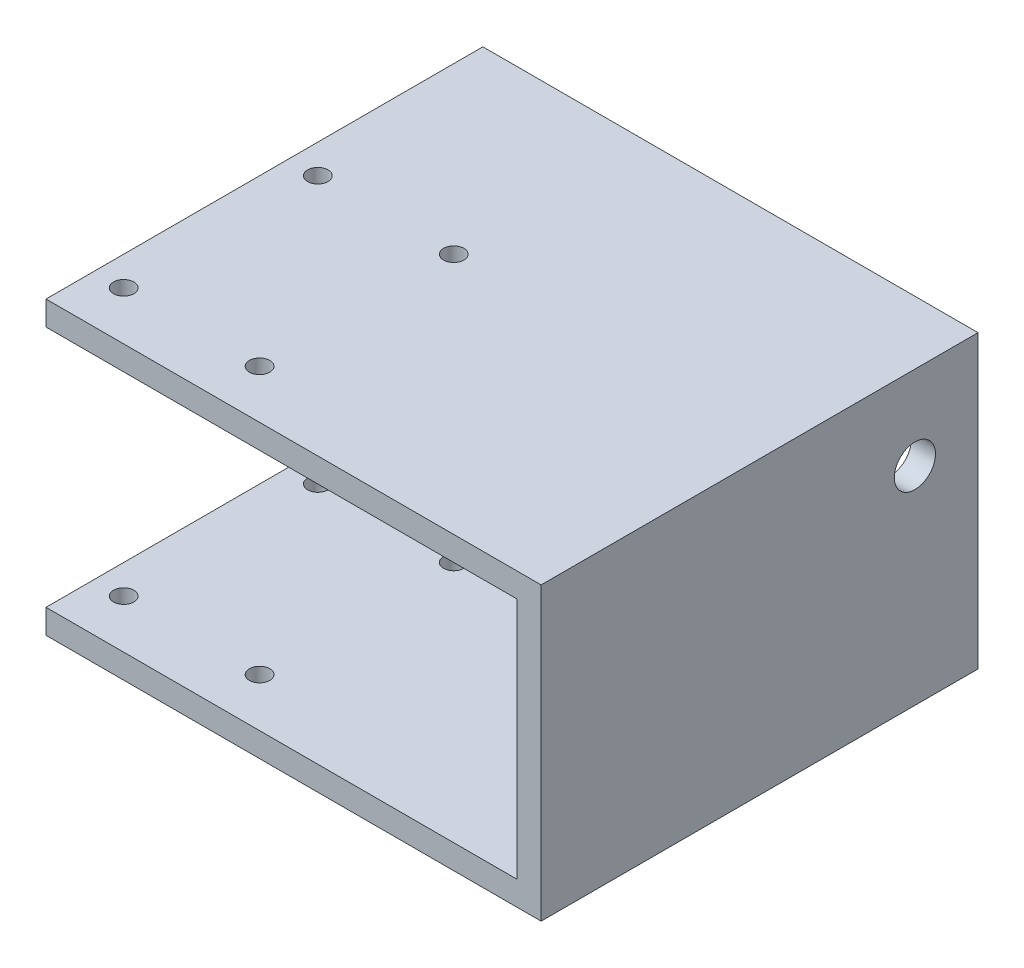
ISO-10303-21;
HEADER;
FILE_DESCRIPTION(('STEP AP214'),'2;1');
FILE_NAME('part.step','',(''),(''),'','','');
FILE_SCHEMA(('AUTOMOTIVE_DESIGN { 1 0 10303 214 1 1 1 1 }'));
ENDSEC;
DATA;
#1=APPLICATION_CONTEXT('core data for automotive mechanical design processes');
#2=APPLICATION_PROTOCOL_DEFINITION('international standard','automotive_design',2000,#1);
#3=PRODUCT_CONTEXT('',#1,'mechanical');
#4=PRODUCT('Part','Part','',(#3));
#5=PRODUCT_RELATED_PRODUCT_CATEGORY('part','',(#4));
#6=PRODUCT_DEFINITION_FORMATION('','',#4);
#7=PRODUCT_DEFINITION_CONTEXT('part definition',#1,'design');
#8=PRODUCT_DEFINITION('design','',#6,#7);
#9=PRODUCT_DEFINITION_SHAPE('','',#8);
#10=(LENGTH_UNIT() NAMED_UNIT(*) SI_UNIT(.MILLI.,.METRE.));
#11=(NAMED_UNIT(*) PLANE_ANGLE_UNIT() SI_UNIT($,.RADIAN.));
#12=(NAMED_UNIT(*) SI_UNIT($,.STERADIAN.) SOLID_ANGLE_UNIT());
#13=UNCERTAINTY_MEASURE_WITH_UNIT(LENGTH_MEASURE(1.E-05),#10,'distance_accuracy_value','');
#14=(GEOMETRIC_REPRESENTATION_CONTEXT(3) GLOBAL_UNCERTAINTY_ASSIGNED_CONTEXT((#13)) GLOBAL_UNIT_ASSIGNED_CONTEXT((#10,
#11,#12)) REPRESENTATION_CONTEXT('',''));
#15=CARTESIAN_POINT('',(0.,0.,0.));
#16=DIRECTION('',(0.,0.,1.));
#17=DIRECTION('',(1.,0.,0.));
#18=AXIS2_PLACEMENT_3D('',#15,#16,#17);
#19=CARTESIAN_POINT('',(0.,-55.,90.));
#20=DIRECTION('',(-1.,0.,0.));
#21=DIRECTION('',(0.,0.,1.));
#22=AXIS2_PLACEMENT_3D('',#19,#20,#21);
#23=PLANE('',#22);
#24=DIRECTION('',(0.,1.,0.));
#25=VECTOR('',#24,1.);
#26=CARTESIAN_POINT('',(0.,-55.,0.));
#27=LINE('',#26,#25);
#28=CARTESIAN_POINT('',(0.,-55.,0.));
#29=VERTEX_POINT('',#28);
#30=CARTESIAN_POINT('',(0.,-50.,0.));
#31=VERTEX_POINT('',#30);
#32=EDGE_CURVE('E139',#29,#31,#27,.T.);
#33=ORIENTED_EDGE('',*,*,#32,.F.);
#34=DIRECTION('',(0.,0.,-1.));
#35=VECTOR('',#34,1.);
#36=CARTESIAN_POINT('',(0.,-55.,90.));
#37=LINE('',#36,#35);
#38=CARTESIAN_POINT('',(0.,-55.,90.));
#39=VERTEX_POINT('',#38);
#40=EDGE_CURVE('E11',#39,#29,#37,.T.);
#41=ORIENTED_EDGE('',*,*,#40,.F.);
#42=DIRECTION('',(0.,1.,0.));
#43=VECTOR('',#42,1.);
#44=CARTESIAN_POINT('',(0.,-55.,90.));
#45=LINE('',#44,#43);
#46=CARTESIAN_POINT('',(0.,-50.,90.));
#47=VERTEX_POINT('',#46);
#48=EDGE_CURVE('E160',#39,#47,#45,.T.);
#49=ORIENTED_EDGE('',*,*,#48,.T.);
#50=DIRECTION('',(0.,0.,-1.));
#51=VECTOR('',#50,1.);
#52=CARTESIAN_POINT('',(0.,-50.,90.));
#53=LINE('',#52,#51);
#54=EDGE_CURVE('E97',#47,#31,#53,.T.);
#55=ORIENTED_EDGE('',*,*,#54,.T.);
#56=EDGE_LOOP('',(#33,#41,#49,#55));
#57=FACE_BOUND('',#56,.T.);
#58=ADVANCED_FACE('F41',(#57),#23,.T.);
#59=CARTESIAN_POINT('',(102.,-55.,90.));
#60=DIRECTION('',(0.,-1.,0.));
#61=DIRECTION('',(1.,0.,0.));
#62=AXIS2_PLACEMENT_3D('',#59,#60,#61);
#63=PLANE('',#62);
#64=CARTESIAN_POINT('',(6.,-55.,80.));
#65=DIRECTION('',(0.,1.,0.));
#66=DIRECTION('',(0.,0.,1.));
#67=AXIS2_PLACEMENT_3D('',#64,#65,#66);
#68=CIRCLE('',#67,2.1);
#69=CARTESIAN_POINT('',(6.,-55.,82.1));
#70=VERTEX_POINT('',#69);
#71=EDGE_CURVE('E270',#70,#70,#68,.T.);
#72=ORIENTED_EDGE('',*,*,#71,.T.);
#73=EDGE_LOOP('',(#72));
#74=FACE_BOUND('',#73,.T.);
#75=CARTESIAN_POINT('',(34.,-55.,80.));
#76=DIRECTION('',(0.,1.,0.));
#77=DIRECTION('',(0.,0.,1.));
#78=AXIS2_PLACEMENT_3D('',#75,#76,#77);
#79=CIRCLE('',#78,2.1);
#80=CARTESIAN_POINT('',(34.,-55.,82.1));
#81=VERTEX_POINT('',#80);
#82=EDGE_CURVE('E277',#81,#81,#79,.T.);
#83=ORIENTED_EDGE('',*,*,#82,.T.);
#84=EDGE_LOOP('',(#83));
#85=FACE_BOUND('',#84,.T.);
#86=CARTESIAN_POINT('',(34.,-55.,40.));
#87=DIRECTION('',(0.,1.,0.));
#88=DIRECTION('',(0.,0.,1.));
#89=AXIS2_PLACEMENT_3D('',#86,#87,#88);
#90=CIRCLE('',#89,2.1);
#91=CARTESIAN_POINT('',(34.,-55.,42.1));
#92=VERTEX_POINT('',#91);
#93=EDGE_CURVE('E263',#92,#92,#90,.T.);
#94=ORIENTED_EDGE('',*,*,#93,.T.);
#95=EDGE_LOOP('',(#94));
#96=FACE_BOUND('',#95,.T.);
#97=CARTESIAN_POINT('',(5.99999999999999,-55.,40.));
#98=DIRECTION('',(0.,1.,0.));
#99=DIRECTION('',(0.,0.,1.));
#100=AXIS2_PLACEMENT_3D('',#97,#98,#99);
#101=CIRCLE('',#100,2.1);
#102=CARTESIAN_POINT('',(5.99999999999999,-55.,42.1));
#103=VERTEX_POINT('',#102);
#104=EDGE_CURVE('E261',#103,#103,#101,.T.);
#105=ORIENTED_EDGE('',*,*,#104,.T.);
#106=EDGE_LOOP('',(#105));
#107=FACE_BOUND('',#106,.T.);
#108=DIRECTION('',(-1.,0.,0.));
#109=VECTOR('',#108,1.);
#110=CARTESIAN_POINT('',(102.,-55.,0.));
#111=LINE('',#110,#109);
#112=CARTESIAN_POINT('',(102.,-55.,0.));
#113=VERTEX_POINT('',#112);
#114=EDGE_CURVE('E158',#113,#29,#111,.T.);
#115=ORIENTED_EDGE('',*,*,#114,.F.);
#116=DIRECTION('',(0.,0.,-1.));
#117=VECTOR('',#116,1.);
#118=CARTESIAN_POINT('',(102.,-55.,90.));
#119=LINE('',#118,#117);
#120=CARTESIAN_POINT('',(102.,-55.,90.));
#121=VERTEX_POINT('',#120);
#122=EDGE_CURVE('E50',#121,#113,#119,.T.);
#123=ORIENTED_EDGE('',*,*,#122,.F.);
#124=DIRECTION('',(-1.,0.,0.));
#125=VECTOR('',#124,1.);
#126=CARTESIAN_POINT('',(102.,-55.,90.));
#127=LINE('',#126,#125);
#128=EDGE_CURVE('E129',#121,#39,#127,.T.);
#129=ORIENTED_EDGE('',*,*,#128,.T.);
#130=ORIENTED_EDGE('',*,*,#40,.T.);
#131=EDGE_LOOP('',(#115,#123,#129,#130));
#132=FACE_BOUND('',#131,.T.);
#133=ADVANCED_FACE('F213',(#74,#85,#96,#107,#132),#63,.T.);
#134=CARTESIAN_POINT('',(102.,5.,90.));
#135=DIRECTION('',(1.,0.,0.));
#136=DIRECTION('',(0.,1.,0.));
#137=AXIS2_PLACEMENT_3D('',#134,#135,#136);
#138=PLANE('',#137);
#139=CARTESIAN_POINT('',(102.,-12.25,13.));
#140=DIRECTION('',(-1.,0.,0.));
#141=DIRECTION('',(0.,0.,1.));
#142=AXIS2_PLACEMENT_3D('',#139,#140,#141);
#143=CIRCLE('',#142,4.25);
#144=CARTESIAN_POINT('',(102.,-12.25,17.25));
#145=VERTEX_POINT('',#144);
#146=EDGE_CURVE('E276',#145,#145,#143,.T.);
#147=ORIENTED_EDGE('',*,*,#146,.T.);
#148=EDGE_LOOP('',(#147));
#149=FACE_BOUND('',#148,.T.);
#150=DIRECTION('',(0.,-1.,0.));
#151=VECTOR('',#150,1.);
#152=CARTESIAN_POINT('',(102.,5.,0.));
#153=LINE('',#152,#151);
#154=CARTESIAN_POINT('',(102.,5.,0.));
#155=VERTEX_POINT('',#154);
#156=EDGE_CURVE('E116',#155,#113,#153,.T.);
#157=ORIENTED_EDGE('',*,*,#156,.F.);
#158=DIRECTION('',(0.,0.,-1.));
#159=VECTOR('',#158,1.);
#160=CARTESIAN_POINT('',(102.,5.,90.));
#161=LINE('',#160,#159);
#162=CARTESIAN_POINT('',(102.,5.,90.));
#163=VERTEX_POINT('',#162);
#164=EDGE_CURVE('E111',#163,#155,#161,.T.);
#165=ORIENTED_EDGE('',*,*,#164,.F.);
#166=DIRECTION('',(0.,-1.,0.));
#167=VECTOR('',#166,1.);
#168=CARTESIAN_POINT('',(102.,5.,90.));
#169=LINE('',#168,#167);
#170=EDGE_CURVE('E114',#163,#121,#169,.T.);
#171=ORIENTED_EDGE('',*,*,#170,.T.);
#172=ORIENTED_EDGE('',*,*,#122,.T.);
#173=EDGE_LOOP('',(#157,#165,#171,#172));
#174=FACE_BOUND('',#173,.T.);
#175=ADVANCED_FACE('F113',(#149,#174),#138,.T.);
#176=CARTESIAN_POINT('',(0.,5.,90.));
#177=DIRECTION('',(0.,1.,0.));
#178=DIRECTION('',(0.,0.,1.));
#179=AXIS2_PLACEMENT_3D('',#176,#177,#178);
#180=PLANE('',#179);
#181=CARTESIAN_POINT('',(6.,5.,80.));
#182=DIRECTION('',(0.,1.,0.));
#183=DIRECTION('',(0.,0.,1.));
#184=AXIS2_PLACEMENT_3D('',#181,#182,#183);
#185=CIRCLE('',#184,2.1);
#186=CARTESIAN_POINT('',(6.,5.,82.1));
#187=VERTEX_POINT('',#186);
#188=EDGE_CURVE('E273',#187,#187,#185,.T.);
#189=ORIENTED_EDGE('',*,*,#188,.F.);
#190=EDGE_LOOP('',(#189));
#191=FACE_BOUND('',#190,.T.);
#192=CARTESIAN_POINT('',(34.,5.,80.));
#193=DIRECTION('',(0.,1.,0.));
#194=DIRECTION('',(0.,0.,1.));
#195=AXIS2_PLACEMENT_3D('',#192,#193,#194);
#196=CIRCLE('',#195,2.1);
#197=CARTESIAN_POINT('',(34.,5.,82.1));
#198=VERTEX_POINT('',#197);
#199=EDGE_CURVE('E272',#198,#198,#196,.T.);
#200=ORIENTED_EDGE('',*,*,#199,.F.);
#201=EDGE_LOOP('',(#200));
#202=FACE_BOUND('',#201,.T.);
#203=CARTESIAN_POINT('',(34.,5.,40.));
#204=DIRECTION('',(0.,1.,0.));
#205=DIRECTION('',(0.,0.,1.));
#206=AXIS2_PLACEMENT_3D('',#203,#204,#205);
#207=CIRCLE('',#206,2.1);
#208=CARTESIAN_POINT('',(34.,5.,42.1));
#209=VERTEX_POINT('',#208);
#210=EDGE_CURVE('E267',#209,#209,#207,.T.);
#211=ORIENTED_EDGE('',*,*,#210,.F.);
#212=EDGE_LOOP('',(#211));
#213=FACE_BOUND('',#212,.T.);
#214=CARTESIAN_POINT('',(5.99999999999999,5.,40.));
#215=DIRECTION('',(0.,1.,0.));
#216=DIRECTION('',(0.,0.,1.));
#217=AXIS2_PLACEMENT_3D('',#214,#215,#216);
#218=CIRCLE('',#217,2.1);
#219=CARTESIAN_POINT('',(5.99999999999999,5.,42.1));
#220=VERTEX_POINT('',#219);
#221=EDGE_CURVE('E175',#220,#220,#218,.T.);
#222=ORIENTED_EDGE('',*,*,#221,.F.);
#223=EDGE_LOOP('',(#222));
#224=FACE_BOUND('',#223,.T.);
#225=DIRECTION('',(1.,0.,0.));
#226=VECTOR('',#225,1.);
#227=CARTESIAN_POINT('',(0.,5.,0.));
#228=LINE('',#227,#226);
#229=CARTESIAN_POINT('',(0.,5.,0.));
#230=VERTEX_POINT('',#229);
#231=EDGE_CURVE('E155',#230,#155,#228,.T.);
#232=ORIENTED_EDGE('',*,*,#231,.F.);
#233=DIRECTION('',(0.,0.,-1.));
#234=VECTOR('',#233,1.);
#235=CARTESIAN_POINT('',(0.,5.,90.));
#236=LINE('',#235,#234);
#237=CARTESIAN_POINT('',(0.,5.,90.));
#238=VERTEX_POINT('',#237);
#239=EDGE_CURVE('E121',#238,#230,#236,.T.);
#240=ORIENTED_EDGE('',*,*,#239,.F.);
#241=DIRECTION('',(1.,0.,0.));
#242=VECTOR('',#241,1.);
#243=CARTESIAN_POINT('',(0.,5.,90.));
#244=LINE('',#243,#242);
#245=EDGE_CURVE('E127',#238,#163,#244,.T.);
#246=ORIENTED_EDGE('',*,*,#245,.T.);
#247=ORIENTED_EDGE('',*,*,#164,.T.);
#248=EDGE_LOOP('',(#232,#240,#246,#247));
#249=FACE_BOUND('',#248,.T.);
#250=ADVANCED_FACE('F131',(#191,#202,#213,#224,#249),#180,.T.);
#251=CARTESIAN_POINT('',(0.,0.,90.));
#252=DIRECTION('',(-1.,0.,0.));
#253=DIRECTION('',(0.,0.,1.));
#254=AXIS2_PLACEMENT_3D('',#251,#252,#253);
#255=PLANE('',#254);
#256=DIRECTION('',(0.,1.,0.));
#257=VECTOR('',#256,1.);
#258=CARTESIAN_POINT('',(0.,0.,0.));
#259=LINE('',#258,#257);
#260=CARTESIAN_POINT('',(0.,0.,0.));
#261=VERTEX_POINT('',#260);
#262=EDGE_CURVE('E152',#261,#230,#259,.T.);
#263=ORIENTED_EDGE('',*,*,#262,.F.);
#264=DIRECTION('',(0.,0.,-1.));
#265=VECTOR('',#264,1.);
#266=CARTESIAN_POINT('',(0.,0.,90.));
#267=LINE('',#266,#265);
#268=CARTESIAN_POINT('',(0.,0.,90.));
#269=VERTEX_POINT('',#268);
#270=EDGE_CURVE('E164',#269,#261,#267,.T.);
#271=ORIENTED_EDGE('',*,*,#270,.F.);
#272=DIRECTION('',(0.,1.,0.));
#273=VECTOR('',#272,1.);
#274=CARTESIAN_POINT('',(0.,0.,90.));
#275=LINE('',#274,#273);
#276=EDGE_CURVE('E132',#269,#238,#275,.T.);
#277=ORIENTED_EDGE('',*,*,#276,.T.);
#278=ORIENTED_EDGE('',*,*,#239,.T.);
#279=EDGE_LOOP('',(#263,#271,#277,#278));
#280=FACE_BOUND('',#279,.T.);
#281=ADVANCED_FACE('F231',(#280),#255,.T.);
#282=CARTESIAN_POINT('',(97.,0.,90.));
#283=DIRECTION('',(0.,-1.,0.));
#284=DIRECTION('',(1.,0.,0.));
#285=AXIS2_PLACEMENT_3D('',#282,#283,#284);
#286=PLANE('',#285);
#287=CARTESIAN_POINT('',(6.,0.,80.));
#288=DIRECTION('',(0.,-1.,0.));
#289=DIRECTION('',(1.,0.,0.));
#290=AXIS2_PLACEMENT_3D('',#287,#288,#289);
#291=CIRCLE('',#290,2.1);
#292=CARTESIAN_POINT('',(8.09999999999999,0.,80.));
#293=VERTEX_POINT('',#292);
#294=EDGE_CURVE('E143',#293,#293,#291,.F.);
#295=ORIENTED_EDGE('',*,*,#294,.T.);
#296=EDGE_LOOP('',(#295));
#297=FACE_BOUND('',#296,.T.);
#298=CARTESIAN_POINT('',(34.,0.,80.));
#299=DIRECTION('',(0.,-1.,0.));
#300=DIRECTION('',(1.,0.,0.));
#301=AXIS2_PLACEMENT_3D('',#298,#299,#300);
#302=CIRCLE('',#301,2.1);
#303=CARTESIAN_POINT('',(36.1,0.,80.));
#304=VERTEX_POINT('',#303);
#305=EDGE_CURVE('E181',#304,#304,#302,.F.);
#306=ORIENTED_EDGE('',*,*,#305,.T.);
#307=EDGE_LOOP('',(#306));
#308=FACE_BOUND('',#307,.T.);
#309=CARTESIAN_POINT('',(34.,0.,40.));
#310=DIRECTION('',(0.,-1.,0.));
#311=DIRECTION('',(1.,0.,0.));
#312=AXIS2_PLACEMENT_3D('',#309,#310,#311);
#313=CIRCLE('',#312,2.1);
#314=CARTESIAN_POINT('',(36.1,0.,40.));
#315=VERTEX_POINT('',#314);
#316=EDGE_CURVE('E178',#315,#315,#313,.F.);
#317=ORIENTED_EDGE('',*,*,#316,.T.);
#318=EDGE_LOOP('',(#317));
#319=FACE_BOUND('',#318,.T.);
#320=CARTESIAN_POINT('',(5.99999999999999,0.,40.));
#321=DIRECTION('',(0.,-1.,0.));
#322=DIRECTION('',(1.,0.,0.));
#323=AXIS2_PLACEMENT_3D('',#320,#321,#322);
#324=CIRCLE('',#323,2.1);
#325=CARTESIAN_POINT('',(8.09999999999999,0.,40.));
#326=VERTEX_POINT('',#325);
#327=EDGE_CURVE('E174',#326,#326,#324,.F.);
#328=ORIENTED_EDGE('',*,*,#327,.T.);
#329=EDGE_LOOP('',(#328));
#330=FACE_BOUND('',#329,.T.);
#331=DIRECTION('',(-1.,0.,0.));
#332=VECTOR('',#331,1.);
#333=CARTESIAN_POINT('',(97.,0.,0.));
#334=LINE('',#333,#332);
#335=CARTESIAN_POINT('',(97.,0.,0.));
#336=VERTEX_POINT('',#335);
#337=EDGE_CURVE('E149',#336,#261,#334,.T.);
#338=ORIENTED_EDGE('',*,*,#337,.F.);
#339=DIRECTION('',(0.,0.,-1.));
#340=VECTOR('',#339,1.);
#341=CARTESIAN_POINT('',(97.,0.,90.));
#342=LINE('',#341,#340);
#343=CARTESIAN_POINT('',(97.,0.,90.));
#344=VERTEX_POINT('',#343);
#345=EDGE_CURVE('E166',#344,#336,#342,.T.);
#346=ORIENTED_EDGE('',*,*,#345,.F.);
#347=DIRECTION('',(-1.,0.,0.));
#348=VECTOR('',#347,1.);
#349=CARTESIAN_POINT('',(97.,0.,90.));
#350=LINE('',#349,#348);
#351=EDGE_CURVE('E134',#344,#269,#350,.T.);
#352=ORIENTED_EDGE('',*,*,#351,.T.);
#353=ORIENTED_EDGE('',*,*,#270,.T.);
#354=EDGE_LOOP('',(#338,#346,#352,#353));
#355=FACE_BOUND('',#354,.T.);
#356=ADVANCED_FACE('F204',(#297,#308,#319,#330,#355),#286,.T.);
#357=CARTESIAN_POINT('',(97.,-50.,90.));
#358=DIRECTION('',(-1.,0.,0.));
#359=DIRECTION('',(0.,0.,1.));
#360=AXIS2_PLACEMENT_3D('',#357,#358,#359);
#361=PLANE('',#360);
#362=CARTESIAN_POINT('',(97.,-12.25,13.));
#363=DIRECTION('',(-1.,0.,0.));
#364=DIRECTION('',(0.,0.,1.));
#365=AXIS2_PLACEMENT_3D('',#362,#363,#364);
#366=CIRCLE('',#365,4.25);
#367=CARTESIAN_POINT('',(97.,-12.25,17.25));
#368=VERTEX_POINT('',#367);
#369=EDGE_CURVE('E284',#368,#368,#366,.T.);
#370=ORIENTED_EDGE('',*,*,#369,.F.);
#371=EDGE_LOOP('',(#370));
#372=FACE_BOUND('',#371,.T.);
#373=DIRECTION('',(0.,1.,0.));
#374=VECTOR('',#373,1.);
#375=CARTESIAN_POINT('',(97.,-50.,0.));
#376=LINE('',#375,#374);
#377=CARTESIAN_POINT('',(97.,-50.,0.));
#378=VERTEX_POINT('',#377);
#379=EDGE_CURVE('E146',#378,#336,#376,.T.);
#380=ORIENTED_EDGE('',*,*,#379,.F.);
#381=DIRECTION('',(0.,0.,-1.));
#382=VECTOR('',#381,1.);
#383=CARTESIAN_POINT('',(97.,-50.,90.));
#384=LINE('',#383,#382);
#385=CARTESIAN_POINT('',(97.,-50.,90.));
#386=VERTEX_POINT('',#385);
#387=EDGE_CURVE('E168',#386,#378,#384,.T.);
#388=ORIENTED_EDGE('',*,*,#387,.F.);
#389=DIRECTION('',(0.,1.,0.));
#390=VECTOR('',#389,1.);
#391=CARTESIAN_POINT('',(97.,-50.,90.));
#392=LINE('',#391,#390);
#393=EDGE_CURVE('E198',#386,#344,#392,.T.);
#394=ORIENTED_EDGE('',*,*,#393,.T.);
#395=ORIENTED_EDGE('',*,*,#345,.T.);
#396=EDGE_LOOP('',(#380,#388,#394,#395));
#397=FACE_BOUND('',#396,.T.);
#398=ADVANCED_FACE('F209',(#372,#397),#361,.T.);
#399=CARTESIAN_POINT('',(0.,-50.,90.));
#400=DIRECTION('',(0.,1.,0.));
#401=DIRECTION('',(0.,0.,1.));
#402=AXIS2_PLACEMENT_3D('',#399,#400,#401);
#403=PLANE('',#402);
#404=CARTESIAN_POINT('',(6.,-50.,80.));
#405=DIRECTION('',(0.,1.,0.));
#406=DIRECTION('',(0.,0.,1.));
#407=AXIS2_PLACEMENT_3D('',#404,#405,#406);
#408=CIRCLE('',#407,2.1);
#409=CARTESIAN_POINT('',(6.,-50.,82.1));
#410=VERTEX_POINT('',#409);
#411=EDGE_CURVE('E44',#410,#410,#408,.F.);
#412=ORIENTED_EDGE('',*,*,#411,.T.);
#413=EDGE_LOOP('',(#412));
#414=FACE_BOUND('',#413,.T.);
#415=CARTESIAN_POINT('',(34.,-50.,80.));
#416=DIRECTION('',(0.,1.,0.));
#417=DIRECTION('',(0.,0.,1.));
#418=AXIS2_PLACEMENT_3D('',#415,#416,#417);
#419=CIRCLE('',#418,2.1);
#420=CARTESIAN_POINT('',(34.,-50.,82.1));
#421=VERTEX_POINT('',#420);
#422=EDGE_CURVE('E179',#421,#421,#419,.F.);
#423=ORIENTED_EDGE('',*,*,#422,.T.);
#424=EDGE_LOOP('',(#423));
#425=FACE_BOUND('',#424,.T.);
#426=CARTESIAN_POINT('',(34.,-50.,40.));
#427=DIRECTION('',(0.,1.,0.));
#428=DIRECTION('',(0.,0.,1.));
#429=AXIS2_PLACEMENT_3D('',#426,#427,#428);
#430=CIRCLE('',#429,2.1);
#431=CARTESIAN_POINT('',(34.,-50.,42.1));
#432=VERTEX_POINT('',#431);
#433=EDGE_CURVE('E176',#432,#432,#430,.F.);
#434=ORIENTED_EDGE('',*,*,#433,.T.);
#435=EDGE_LOOP('',(#434));
#436=FACE_BOUND('',#435,.T.);
#437=CARTESIAN_POINT('',(5.99999999999999,-50.,40.));
#438=DIRECTION('',(0.,1.,0.));
#439=DIRECTION('',(0.,0.,1.));
#440=AXIS2_PLACEMENT_3D('',#437,#438,#439);
#441=CIRCLE('',#440,2.1);
#442=CARTESIAN_POINT('',(5.99999999999999,-50.,42.1));
#443=VERTEX_POINT('',#442);
#444=EDGE_CURVE('E171',#443,#443,#441,.F.);
#445=ORIENTED_EDGE('',*,*,#444,.T.);
#446=EDGE_LOOP('',(#445));
#447=FACE_BOUND('',#446,.T.);
#448=DIRECTION('',(1.,0.,0.));
#449=VECTOR('',#448,1.);
#450=CARTESIAN_POINT('',(0.,-50.,0.));
#451=LINE('',#450,#449);
#452=EDGE_CURVE('E142',#31,#378,#451,.T.);
#453=ORIENTED_EDGE('',*,*,#452,.F.);
#454=ORIENTED_EDGE('',*,*,#54,.F.);
#455=DIRECTION('',(1.,0.,0.));
#456=VECTOR('',#455,1.);
#457=CARTESIAN_POINT('',(0.,-50.,90.));
#458=LINE('',#457,#456);
#459=EDGE_CURVE('E196',#47,#386,#458,.T.);
#460=ORIENTED_EDGE('',*,*,#459,.T.);
#461=ORIENTED_EDGE('',*,*,#387,.T.);
#462=EDGE_LOOP('',(#453,#454,#460,#461));
#463=FACE_BOUND('',#462,.T.);
#464=ADVANCED_FACE('F210',(#414,#425,#436,#447,#463),#403,.T.);
#465=CARTESIAN_POINT('',(0.,0.,90.));
#466=DIRECTION('',(0.,0.,-1.));
#467=DIRECTION('',(-1.,0.,0.));
#468=AXIS2_PLACEMENT_3D('',#465,#466,#467);
#469=PLANE('',#468);
#470=ORIENTED_EDGE('',*,*,#48,.F.);
#471=ORIENTED_EDGE('',*,*,#128,.F.);
#472=ORIENTED_EDGE('',*,*,#170,.F.);
#473=ORIENTED_EDGE('',*,*,#245,.F.);
#474=ORIENTED_EDGE('',*,*,#276,.F.);
#475=ORIENTED_EDGE('',*,*,#351,.F.);
#476=ORIENTED_EDGE('',*,*,#393,.F.);
#477=ORIENTED_EDGE('',*,*,#459,.F.);
#478=EDGE_LOOP('',(#470,#471,#472,#473,#474,#475,#476,#477));
#479=FACE_BOUND('',#478,.T.);
#480=ADVANCED_FACE('F125',(#479),#469,.F.);
#481=CARTESIAN_POINT('',(0.,0.,0.));
#482=DIRECTION('',(0.,0.,-1.));
#483=DIRECTION('',(-1.,0.,0.));
#484=AXIS2_PLACEMENT_3D('',#481,#482,#483);
#485=PLANE('',#484);
#486=ORIENTED_EDGE('',*,*,#32,.T.);
#487=ORIENTED_EDGE('',*,*,#452,.T.);
#488=ORIENTED_EDGE('',*,*,#379,.T.);
#489=ORIENTED_EDGE('',*,*,#337,.T.);
#490=ORIENTED_EDGE('',*,*,#262,.T.);
#491=ORIENTED_EDGE('',*,*,#231,.T.);
#492=ORIENTED_EDGE('',*,*,#156,.T.);
#493=ORIENTED_EDGE('',*,*,#114,.T.);
#494=EDGE_LOOP('',(#486,#487,#488,#489,#490,#491,#492,#493));
#495=FACE_BOUND('',#494,.T.);
#496=ADVANCED_FACE('F212',(#495),#485,.T.);
#497=CARTESIAN_POINT('',(5.99999999999999,5.,40.));
#498=DIRECTION('',(0.,-1.,0.));
#499=DIRECTION('',(0.,0.,-1.));
#500=AXIS2_PLACEMENT_3D('',#497,#498,#499);
#501=CYLINDRICAL_SURFACE('',#500,2.1);
#502=ORIENTED_EDGE('',*,*,#444,.F.);
#503=EDGE_LOOP('',(#502));
#504=FACE_BOUND('',#503,.T.);
#505=ORIENTED_EDGE('',*,*,#104,.F.);
#506=EDGE_LOOP('',(#505));
#507=FACE_BOUND('',#506,.T.);
#508=ADVANCED_FACE('F254',(#504,#507),#501,.F.);
#509=CARTESIAN_POINT('',(34.,5.,40.));
#510=DIRECTION('',(0.,-1.,0.));
#511=DIRECTION('',(0.,0.,-1.));
#512=AXIS2_PLACEMENT_3D('',#509,#510,#511);
#513=CYLINDRICAL_SURFACE('',#512,2.1);
#514=ORIENTED_EDGE('',*,*,#433,.F.);
#515=EDGE_LOOP('',(#514));
#516=FACE_BOUND('',#515,.T.);
#517=ORIENTED_EDGE('',*,*,#93,.F.);
#518=EDGE_LOOP('',(#517));
#519=FACE_BOUND('',#518,.T.);
#520=ADVANCED_FACE('F256',(#516,#519),#513,.F.);
#521=CARTESIAN_POINT('',(34.,5.,80.));
#522=DIRECTION('',(0.,-1.,0.));
#523=DIRECTION('',(0.,0.,-1.));
#524=AXIS2_PLACEMENT_3D('',#521,#522,#523);
#525=CYLINDRICAL_SURFACE('',#524,2.1);
#526=ORIENTED_EDGE('',*,*,#422,.F.);
#527=EDGE_LOOP('',(#526));
#528=FACE_BOUND('',#527,.T.);
#529=ORIENTED_EDGE('',*,*,#82,.F.);
#530=EDGE_LOOP('',(#529));
#531=FACE_BOUND('',#530,.T.);
#532=ADVANCED_FACE('F306',(#528,#531),#525,.F.);
#533=CARTESIAN_POINT('',(6.,5.,80.));
#534=DIRECTION('',(0.,-1.,0.));
#535=DIRECTION('',(0.,0.,-1.));
#536=AXIS2_PLACEMENT_3D('',#533,#534,#535);
#537=CYLINDRICAL_SURFACE('',#536,2.1);
#538=ORIENTED_EDGE('',*,*,#411,.F.);
#539=EDGE_LOOP('',(#538));
#540=FACE_BOUND('',#539,.T.);
#541=ORIENTED_EDGE('',*,*,#71,.F.);
#542=EDGE_LOOP('',(#541));
#543=FACE_BOUND('',#542,.T.);
#544=ADVANCED_FACE('F302',(#540,#543),#537,.F.);
#545=ORIENTED_EDGE('',*,*,#327,.F.);
#546=EDGE_LOOP('',(#545));
#547=FACE_BOUND('',#546,.T.);
#548=ORIENTED_EDGE('',*,*,#221,.T.);
#549=EDGE_LOOP('',(#548));
#550=FACE_BOUND('',#549,.T.);
#551=ADVANCED_FACE('F258',(#547,#550),#501,.F.);
#552=ORIENTED_EDGE('',*,*,#316,.F.);
#553=EDGE_LOOP('',(#552));
#554=FACE_BOUND('',#553,.T.);
#555=ORIENTED_EDGE('',*,*,#210,.T.);
#556=EDGE_LOOP('',(#555));
#557=FACE_BOUND('',#556,.T.);
#558=ADVANCED_FACE('F308',(#554,#557),#513,.F.);
#559=ORIENTED_EDGE('',*,*,#305,.F.);
#560=EDGE_LOOP('',(#559));
#561=FACE_BOUND('',#560,.T.);
#562=ORIENTED_EDGE('',*,*,#199,.T.);
#563=EDGE_LOOP('',(#562));
#564=FACE_BOUND('',#563,.T.);
#565=ADVANCED_FACE('F299',(#561,#564),#525,.F.);
#566=ORIENTED_EDGE('',*,*,#294,.F.);
#567=EDGE_LOOP('',(#566));
#568=FACE_BOUND('',#567,.T.);
#569=ORIENTED_EDGE('',*,*,#188,.T.);
#570=EDGE_LOOP('',(#569));
#571=FACE_BOUND('',#570,.T.);
#572=ADVANCED_FACE('F293',(#568,#571),#537,.F.);
#573=CARTESIAN_POINT('',(102.,-12.25,13.));
#574=DIRECTION('',(-1.,0.,0.));
#575=DIRECTION('',(0.,0.,1.));
#576=AXIS2_PLACEMENT_3D('',#573,#574,#575);
#577=CYLINDRICAL_SURFACE('',#576,4.25);
#578=ORIENTED_EDGE('',*,*,#146,.F.);
#579=EDGE_LOOP('',(#578));
#580=FACE_BOUND('',#579,.T.);
#581=ORIENTED_EDGE('',*,*,#369,.T.);
#582=EDGE_LOOP('',(#581));
#583=FACE_BOUND('',#582,.T.);
#584=ADVANCED_FACE('F290',(#580,#583),#577,.F.);
#585=CLOSED_SHELL('',(#58,#133,#175,#250,#281,#356,#398,#464,#480,#496,#508,#520,#532,#544,#551,
#558,#565,#572,#584));
#586=MANIFOLD_SOLID_BREP('B2',#585);
#587=ADVANCED_BREP_SHAPE_REPRESENTATION('',(#18,#586),#14);
#588=SHAPE_DEFINITION_REPRESENTATION(#9,#587);
ENDSEC;
END-ISO-10303-21;
